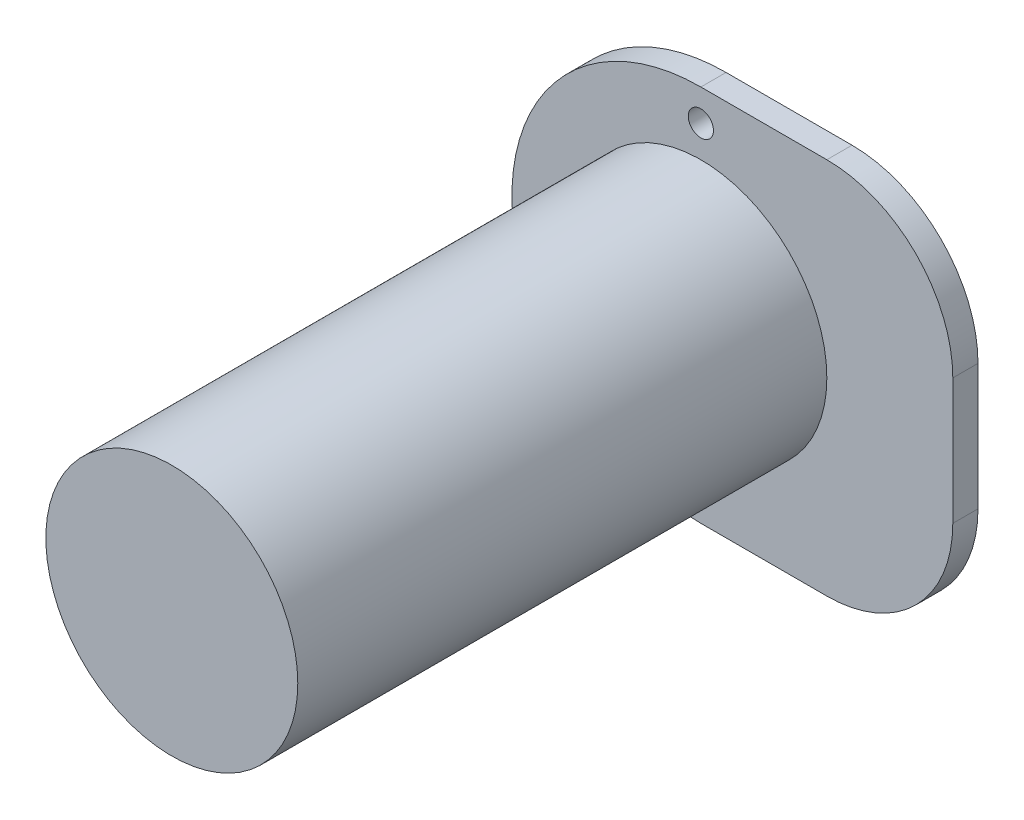
ISO-10303-21;
HEADER;
FILE_DESCRIPTION(('STEP AP214'),'2;1');
FILE_NAME('part.step','',(''),(''),'','','');
FILE_SCHEMA(('AUTOMOTIVE_DESIGN { 1 0 10303 214 1 1 1 1 }'));
ENDSEC;
DATA;
#1=APPLICATION_CONTEXT('core data for automotive mechanical design processes');
#2=APPLICATION_PROTOCOL_DEFINITION('international standard','automotive_design',2000,#1);
#3=PRODUCT_CONTEXT('',#1,'mechanical');
#4=PRODUCT('Part','Part','',(#3));
#5=PRODUCT_RELATED_PRODUCT_CATEGORY('part','',(#4));
#6=PRODUCT_DEFINITION_FORMATION('','',#4);
#7=PRODUCT_DEFINITION_CONTEXT('part definition',#1,'design');
#8=PRODUCT_DEFINITION('design','',#6,#7);
#9=PRODUCT_DEFINITION_SHAPE('','',#8);
#10=(LENGTH_UNIT() NAMED_UNIT(*) SI_UNIT(.MILLI.,.METRE.));
#11=(NAMED_UNIT(*) PLANE_ANGLE_UNIT() SI_UNIT($,.RADIAN.));
#12=(NAMED_UNIT(*) SI_UNIT($,.STERADIAN.) SOLID_ANGLE_UNIT());
#13=UNCERTAINTY_MEASURE_WITH_UNIT(LENGTH_MEASURE(1.E-05),#10,'distance_accuracy_value','');
#14=(GEOMETRIC_REPRESENTATION_CONTEXT(3) GLOBAL_UNCERTAINTY_ASSIGNED_CONTEXT((#13)) GLOBAL_UNIT_ASSIGNED_CONTEXT((#10,
#11,#12)) REPRESENTATION_CONTEXT('',''));
#15=CARTESIAN_POINT('',(0.,0.,0.));
#16=DIRECTION('',(0.,0.,1.));
#17=DIRECTION('',(1.,0.,0.));
#18=AXIS2_PLACEMENT_3D('',#15,#16,#17);
#19=CARTESIAN_POINT('',(0.,0.,105.));
#20=DIRECTION('',(0.,0.,-1.));
#21=DIRECTION('',(-1.,0.,0.));
#22=AXIS2_PLACEMENT_3D('',#19,#20,#21);
#23=CYLINDRICAL_SURFACE('',#22,50.);
#24=CARTESIAN_POINT('',(0.,0.,105.));
#25=DIRECTION('',(0.,0.,1.));
#26=DIRECTION('',(1.,0.,0.));
#27=AXIS2_PLACEMENT_3D('',#24,#25,#26);
#28=CIRCLE('',#27,50.);
#29=CARTESIAN_POINT('',(50.,0.,105.));
#30=VERTEX_POINT('',#29);
#31=EDGE_CURVE('E113',#30,#30,#28,.T.);
#32=ORIENTED_EDGE('',*,*,#31,.F.);
#33=EDGE_LOOP('',(#32));
#34=FACE_BOUND('',#33,.T.);
#35=CARTESIAN_POINT('',(0.,0.,-105.));
#36=DIRECTION('',(0.,0.,1.));
#37=DIRECTION('',(1.,0.,0.));
#38=AXIS2_PLACEMENT_3D('',#35,#36,#37);
#39=CIRCLE('',#38,50.);
#40=CARTESIAN_POINT('',(50.,0.,-105.));
#41=VERTEX_POINT('',#40);
#42=EDGE_CURVE('E109',#41,#41,#39,.T.);
#43=ORIENTED_EDGE('',*,*,#42,.T.);
#44=EDGE_LOOP('',(#43));
#45=FACE_BOUND('',#44,.T.);
#46=ADVANCED_FACE('F35',(#34,#45),#23,.T.);
#47=CARTESIAN_POINT('',(0.,0.,105.));
#48=DIRECTION('',(0.,0.,1.));
#49=DIRECTION('',(1.,0.,0.));
#50=AXIS2_PLACEMENT_3D('',#47,#48,#49);
#51=PLANE('',#50);
#52=ORIENTED_EDGE('',*,*,#31,.T.);
#53=EDGE_LOOP('',(#52));
#54=FACE_BOUND('',#53,.T.);
#55=ADVANCED_FACE('F160',(#54),#51,.T.);
#56=CARTESIAN_POINT('',(0.,0.,-115.));
#57=DIRECTION('',(0.,0.,1.));
#58=DIRECTION('',(1.,0.,0.));
#59=AXIS2_PLACEMENT_3D('',#56,#57,#58);
#60=CYLINDRICAL_SURFACE('',#59,75.);
#61=CARTESIAN_POINT('',(0.,0.,-105.));
#62=DIRECTION('',(0.,0.,-1.));
#63=DIRECTION('',(-1.,0.,0.));
#64=AXIS2_PLACEMENT_3D('',#61,#62,#63);
#65=CIRCLE('',#64,75.);
#66=CARTESIAN_POINT('',(0.,-75.,-105.));
#67=VERTEX_POINT('',#66);
#68=CARTESIAN_POINT('',(0.,75.,-105.));
#69=VERTEX_POINT('',#68);
#70=EDGE_CURVE('E108',#67,#69,#65,.T.);
#71=ORIENTED_EDGE('',*,*,#70,.T.);
#72=DIRECTION('',(0.,0.,1.));
#73=VECTOR('',#72,1.);
#74=CARTESIAN_POINT('',(0.,75.,-115.));
#75=LINE('',#74,#73);
#76=CARTESIAN_POINT('',(0.,75.,-115.));
#77=VERTEX_POINT('',#76);
#78=EDGE_CURVE('E92',#77,#69,#75,.T.);
#79=ORIENTED_EDGE('',*,*,#78,.F.);
#80=CARTESIAN_POINT('',(0.,0.,-115.));
#81=DIRECTION('',(0.,0.,-1.));
#82=DIRECTION('',(-1.,0.,0.));
#83=AXIS2_PLACEMENT_3D('',#80,#81,#82);
#84=CIRCLE('',#83,75.);
#85=CARTESIAN_POINT('',(0.,-75.,-115.));
#86=VERTEX_POINT('',#85);
#87=EDGE_CURVE('E96',#86,#77,#84,.T.);
#88=ORIENTED_EDGE('',*,*,#87,.F.);
#89=DIRECTION('',(0.,0.,1.));
#90=VECTOR('',#89,1.);
#91=CARTESIAN_POINT('',(0.,-75.,-115.));
#92=LINE('',#91,#90);
#93=EDGE_CURVE('E110',#86,#67,#92,.T.);
#94=ORIENTED_EDGE('',*,*,#93,.T.);
#95=EDGE_LOOP('',(#71,#79,#88,#94));
#96=FACE_BOUND('',#95,.T.);
#97=ADVANCED_FACE('F106',(#96),#60,.T.);
#98=CARTESIAN_POINT('',(0.,75.,-115.));
#99=DIRECTION('',(0.,-1.,0.));
#100=DIRECTION('',(1.,0.,0.));
#101=AXIS2_PLACEMENT_3D('',#98,#99,#100);
#102=PLANE('',#101);
#103=DIRECTION('',(1.,0.,0.));
#104=VECTOR('',#103,1.);
#105=CARTESIAN_POINT('',(0.,75.,-105.));
#106=LINE('',#105,#104);
#107=CARTESIAN_POINT('',(50.,75.,-105.));
#108=VERTEX_POINT('',#107);
#109=EDGE_CURVE('E142',#69,#108,#106,.T.);
#110=ORIENTED_EDGE('',*,*,#109,.T.);
#111=DIRECTION('',(0.,0.,1.));
#112=VECTOR('',#111,1.);
#113=CARTESIAN_POINT('',(50.,75.,-115.));
#114=LINE('',#113,#112);
#115=CARTESIAN_POINT('',(50.,75.,-115.));
#116=VERTEX_POINT('',#115);
#117=EDGE_CURVE('E58',#108,#116,#114,.F.);
#118=ORIENTED_EDGE('',*,*,#117,.T.);
#119=DIRECTION('',(1.,0.,0.));
#120=VECTOR('',#119,1.);
#121=CARTESIAN_POINT('',(0.,75.,-115.));
#122=LINE('',#121,#120);
#123=EDGE_CURVE('E88',#77,#116,#122,.T.);
#124=ORIENTED_EDGE('',*,*,#123,.F.);
#125=ORIENTED_EDGE('',*,*,#78,.T.);
#126=EDGE_LOOP('',(#110,#118,#124,#125));
#127=FACE_BOUND('',#126,.T.);
#128=ADVANCED_FACE('F90',(#127),#102,.F.);
#129=CARTESIAN_POINT('',(100.,-75.,-115.));
#130=DIRECTION('',(-1.,0.,0.));
#131=DIRECTION('',(0.,0.,1.));
#132=AXIS2_PLACEMENT_3D('',#129,#130,#131);
#133=PLANE('',#132);
#134=DIRECTION('',(0.,-1.,0.));
#135=VECTOR('',#134,1.);
#136=CARTESIAN_POINT('',(100.,-75.,-115.));
#137=LINE('',#136,#135);
#138=CARTESIAN_POINT('',(100.,25.,-115.));
#139=VERTEX_POINT('',#138);
#140=CARTESIAN_POINT('',(100.,-25.,-115.));
#141=VERTEX_POINT('',#140);
#142=EDGE_CURVE('E95',#139,#141,#137,.T.);
#143=ORIENTED_EDGE('',*,*,#142,.F.);
#144=DIRECTION('',(0.,0.,1.));
#145=VECTOR('',#144,1.);
#146=CARTESIAN_POINT('',(100.,25.,-115.));
#147=LINE('',#146,#145);
#148=CARTESIAN_POINT('',(100.,25.,-105.));
#149=VERTEX_POINT('',#148);
#150=EDGE_CURVE('E122',#139,#149,#147,.T.);
#151=ORIENTED_EDGE('',*,*,#150,.T.);
#152=DIRECTION('',(0.,-1.,0.));
#153=VECTOR('',#152,1.);
#154=CARTESIAN_POINT('',(100.,-75.,-105.));
#155=LINE('',#154,#153);
#156=CARTESIAN_POINT('',(100.,-25.,-105.));
#157=VERTEX_POINT('',#156);
#158=EDGE_CURVE('E143',#149,#157,#155,.T.);
#159=ORIENTED_EDGE('',*,*,#158,.T.);
#160=DIRECTION('',(0.,0.,1.));
#161=VECTOR('',#160,1.);
#162=CARTESIAN_POINT('',(100.,-25.,-115.));
#163=LINE('',#162,#161);
#164=EDGE_CURVE('E119',#157,#141,#163,.F.);
#165=ORIENTED_EDGE('',*,*,#164,.T.);
#166=EDGE_LOOP('',(#143,#151,#159,#165));
#167=FACE_BOUND('',#166,.T.);
#168=ADVANCED_FACE('F134',(#167),#133,.F.);
#169=CARTESIAN_POINT('',(0.,-75.,-115.));
#170=DIRECTION('',(0.,1.,0.));
#171=DIRECTION('',(-1.,0.,0.));
#172=AXIS2_PLACEMENT_3D('',#169,#170,#171);
#173=PLANE('',#172);
#174=DIRECTION('',(-1.,0.,0.));
#175=VECTOR('',#174,1.);
#176=CARTESIAN_POINT('',(0.,-75.,-115.));
#177=LINE('',#176,#175);
#178=CARTESIAN_POINT('',(50.,-75.,-115.));
#179=VERTEX_POINT('',#178);
#180=EDGE_CURVE('E100',#179,#86,#177,.T.);
#181=ORIENTED_EDGE('',*,*,#180,.F.);
#182=DIRECTION('',(0.,0.,1.));
#183=VECTOR('',#182,1.);
#184=CARTESIAN_POINT('',(50.,-75.,-115.));
#185=LINE('',#184,#183);
#186=CARTESIAN_POINT('',(50.,-75.,-105.));
#187=VERTEX_POINT('',#186);
#188=EDGE_CURVE('E11',#179,#187,#185,.T.);
#189=ORIENTED_EDGE('',*,*,#188,.T.);
#190=DIRECTION('',(-1.,0.,0.));
#191=VECTOR('',#190,1.);
#192=CARTESIAN_POINT('',(0.,-75.,-105.));
#193=LINE('',#192,#191);
#194=EDGE_CURVE('E104',#187,#67,#193,.T.);
#195=ORIENTED_EDGE('',*,*,#194,.T.);
#196=ORIENTED_EDGE('',*,*,#93,.F.);
#197=EDGE_LOOP('',(#181,#189,#195,#196));
#198=FACE_BOUND('',#197,.T.);
#199=ADVANCED_FACE('F151',(#198),#173,.F.);
#200=CARTESIAN_POINT('',(0.,0.,-115.));
#201=DIRECTION('',(0.,0.,-1.));
#202=DIRECTION('',(-1.,0.,0.));
#203=AXIS2_PLACEMENT_3D('',#200,#201,#202);
#204=PLANE('',#203);
#205=CARTESIAN_POINT('',(0.,62.5,-115.));
#206=DIRECTION('',(0.,0.,-1.));
#207=DIRECTION('',(-1.,0.,0.));
#208=AXIS2_PLACEMENT_3D('',#205,#206,#207);
#209=CIRCLE('',#208,5.);
#210=CARTESIAN_POINT('',(-5.,62.5,-115.));
#211=VERTEX_POINT('',#210);
#212=EDGE_CURVE('E202',#211,#211,#209,.T.);
#213=ORIENTED_EDGE('',*,*,#212,.F.);
#214=EDGE_LOOP('',(#213));
#215=FACE_BOUND('',#214,.T.);
#216=CARTESIAN_POINT('',(0.,-62.5,-115.));
#217=DIRECTION('',(0.,0.,-1.));
#218=DIRECTION('',(-1.,0.,0.));
#219=AXIS2_PLACEMENT_3D('',#216,#217,#218);
#220=CIRCLE('',#219,5.);
#221=CARTESIAN_POINT('',(-5.,-62.5,-115.));
#222=VERTEX_POINT('',#221);
#223=EDGE_CURVE('E207',#222,#222,#220,.T.);
#224=ORIENTED_EDGE('',*,*,#223,.F.);
#225=EDGE_LOOP('',(#224));
#226=FACE_BOUND('',#225,.T.);
#227=CARTESIAN_POINT('',(-62.5,0.,-115.));
#228=DIRECTION('',(0.,0.,-1.));
#229=DIRECTION('',(-1.,0.,0.));
#230=AXIS2_PLACEMENT_3D('',#227,#228,#229);
#231=CIRCLE('',#230,5.);
#232=CARTESIAN_POINT('',(-67.5,0.,-115.));
#233=VERTEX_POINT('',#232);
#234=EDGE_CURVE('E215',#233,#233,#231,.T.);
#235=ORIENTED_EDGE('',*,*,#234,.F.);
#236=EDGE_LOOP('',(#235));
#237=FACE_BOUND('',#236,.T.);
#238=ORIENTED_EDGE('',*,*,#123,.T.);
#239=CARTESIAN_POINT('',(50.,25.,-115.));
#240=DIRECTION('',(0.,0.,-1.));
#241=DIRECTION('',(-1.,0.,0.));
#242=AXIS2_PLACEMENT_3D('',#239,#240,#241);
#243=CIRCLE('',#242,50.);
#244=EDGE_CURVE('E43',#116,#139,#243,.T.);
#245=ORIENTED_EDGE('',*,*,#244,.T.);
#246=ORIENTED_EDGE('',*,*,#142,.T.);
#247=CARTESIAN_POINT('',(50.,-25.,-115.));
#248=DIRECTION('',(0.,0.,-1.));
#249=DIRECTION('',(-1.,0.,0.));
#250=AXIS2_PLACEMENT_3D('',#247,#248,#249);
#251=CIRCLE('',#250,50.);
#252=EDGE_CURVE('E50',#141,#179,#251,.T.);
#253=ORIENTED_EDGE('',*,*,#252,.T.);
#254=ORIENTED_EDGE('',*,*,#180,.T.);
#255=ORIENTED_EDGE('',*,*,#87,.T.);
#256=EDGE_LOOP('',(#238,#245,#246,#253,#254,#255));
#257=FACE_BOUND('',#256,.T.);
#258=ADVANCED_FACE('F99',(#215,#226,#237,#257),#204,.T.);
#259=CARTESIAN_POINT('',(0.,0.,-105.));
#260=DIRECTION('',(0.,0.,-1.));
#261=DIRECTION('',(-1.,0.,0.));
#262=AXIS2_PLACEMENT_3D('',#259,#260,#261);
#263=PLANE('',#262);
#264=CARTESIAN_POINT('',(0.,62.5,-105.));
#265=DIRECTION('',(0.,0.,-1.));
#266=DIRECTION('',(-1.,0.,0.));
#267=AXIS2_PLACEMENT_3D('',#264,#265,#266);
#268=CIRCLE('',#267,5.);
#269=CARTESIAN_POINT('',(-5.,62.5,-105.));
#270=VERTEX_POINT('',#269);
#271=EDGE_CURVE('E146',#270,#270,#268,.T.);
#272=ORIENTED_EDGE('',*,*,#271,.T.);
#273=EDGE_LOOP('',(#272));
#274=FACE_BOUND('',#273,.T.);
#275=CARTESIAN_POINT('',(0.,-62.5,-105.));
#276=DIRECTION('',(0.,0.,-1.));
#277=DIRECTION('',(-1.,0.,0.));
#278=AXIS2_PLACEMENT_3D('',#275,#276,#277);
#279=CIRCLE('',#278,5.);
#280=CARTESIAN_POINT('',(-5.,-62.5,-105.));
#281=VERTEX_POINT('',#280);
#282=EDGE_CURVE('E203',#281,#281,#279,.T.);
#283=ORIENTED_EDGE('',*,*,#282,.T.);
#284=EDGE_LOOP('',(#283));
#285=FACE_BOUND('',#284,.T.);
#286=CARTESIAN_POINT('',(-62.5,0.,-105.));
#287=DIRECTION('',(0.,0.,-1.));
#288=DIRECTION('',(-1.,0.,0.));
#289=AXIS2_PLACEMENT_3D('',#286,#287,#288);
#290=CIRCLE('',#289,5.);
#291=CARTESIAN_POINT('',(-67.5,0.,-105.));
#292=VERTEX_POINT('',#291);
#293=EDGE_CURVE('E212',#292,#292,#290,.T.);
#294=ORIENTED_EDGE('',*,*,#293,.T.);
#295=EDGE_LOOP('',(#294));
#296=FACE_BOUND('',#295,.T.);
#297=ORIENTED_EDGE('',*,*,#42,.F.);
#298=EDGE_LOOP('',(#297));
#299=FACE_BOUND('',#298,.T.);
#300=ORIENTED_EDGE('',*,*,#158,.F.);
#301=CARTESIAN_POINT('',(50.,25.,-105.));
#302=DIRECTION('',(0.,0.,-1.));
#303=DIRECTION('',(-1.,0.,0.));
#304=AXIS2_PLACEMENT_3D('',#301,#302,#303);
#305=CIRCLE('',#304,50.);
#306=EDGE_CURVE('E127',#149,#108,#305,.F.);
#307=ORIENTED_EDGE('',*,*,#306,.T.);
#308=ORIENTED_EDGE('',*,*,#109,.F.);
#309=ORIENTED_EDGE('',*,*,#70,.F.);
#310=ORIENTED_EDGE('',*,*,#194,.F.);
#311=CARTESIAN_POINT('',(50.,-25.,-105.));
#312=DIRECTION('',(0.,0.,-1.));
#313=DIRECTION('',(-1.,0.,0.));
#314=AXIS2_PLACEMENT_3D('',#311,#312,#313);
#315=CIRCLE('',#314,50.);
#316=EDGE_CURVE('E125',#187,#157,#315,.F.);
#317=ORIENTED_EDGE('',*,*,#316,.T.);
#318=EDGE_LOOP('',(#300,#307,#308,#309,#310,#317));
#319=FACE_BOUND('',#318,.T.);
#320=ADVANCED_FACE('F141',(#274,#285,#296,#299,#319),#263,.F.);
#321=CARTESIAN_POINT('',(-62.5,0.,-105.));
#322=DIRECTION('',(0.,0.,-1.));
#323=DIRECTION('',(-1.,0.,0.));
#324=AXIS2_PLACEMENT_3D('',#321,#322,#323);
#325=CYLINDRICAL_SURFACE('',#324,5.);
#326=ORIENTED_EDGE('',*,*,#293,.F.);
#327=EDGE_LOOP('',(#326));
#328=FACE_BOUND('',#327,.T.);
#329=ORIENTED_EDGE('',*,*,#234,.T.);
#330=EDGE_LOOP('',(#329));
#331=FACE_BOUND('',#330,.T.);
#332=ADVANCED_FACE('F181',(#328,#331),#325,.F.);
#333=CARTESIAN_POINT('',(0.,-62.5,-105.));
#334=DIRECTION('',(0.,0.,-1.));
#335=DIRECTION('',(-1.,0.,0.));
#336=AXIS2_PLACEMENT_3D('',#333,#334,#335);
#337=CYLINDRICAL_SURFACE('',#336,5.);
#338=ORIENTED_EDGE('',*,*,#282,.F.);
#339=EDGE_LOOP('',(#338));
#340=FACE_BOUND('',#339,.T.);
#341=ORIENTED_EDGE('',*,*,#223,.T.);
#342=EDGE_LOOP('',(#341));
#343=FACE_BOUND('',#342,.T.);
#344=ADVANCED_FACE('F188',(#340,#343),#337,.F.);
#345=CARTESIAN_POINT('',(0.,62.5,-105.));
#346=DIRECTION('',(0.,0.,-1.));
#347=DIRECTION('',(-1.,0.,0.));
#348=AXIS2_PLACEMENT_3D('',#345,#346,#347);
#349=CYLINDRICAL_SURFACE('',#348,5.);
#350=ORIENTED_EDGE('',*,*,#271,.F.);
#351=EDGE_LOOP('',(#350));
#352=FACE_BOUND('',#351,.T.);
#353=ORIENTED_EDGE('',*,*,#212,.T.);
#354=EDGE_LOOP('',(#353));
#355=FACE_BOUND('',#354,.T.);
#356=ADVANCED_FACE('F158',(#352,#355),#349,.F.);
#357=CARTESIAN_POINT('',(50.,25.,-115.));
#358=DIRECTION('',(0.,0.,1.));
#359=DIRECTION('',(1.,0.,0.));
#360=AXIS2_PLACEMENT_3D('',#357,#358,#359);
#361=CYLINDRICAL_SURFACE('',#360,50.);
#362=ORIENTED_EDGE('',*,*,#244,.F.);
#363=ORIENTED_EDGE('',*,*,#117,.F.);
#364=ORIENTED_EDGE('',*,*,#306,.F.);
#365=ORIENTED_EDGE('',*,*,#150,.F.);
#366=EDGE_LOOP('',(#362,#363,#364,#365));
#367=FACE_BOUND('',#366,.T.);
#368=ADVANCED_FACE('F139',(#367),#361,.T.);
#369=CARTESIAN_POINT('',(50.,-25.,-115.));
#370=DIRECTION('',(0.,0.,1.));
#371=DIRECTION('',(1.,0.,0.));
#372=AXIS2_PLACEMENT_3D('',#369,#370,#371);
#373=CYLINDRICAL_SURFACE('',#372,50.);
#374=ORIENTED_EDGE('',*,*,#252,.F.);
#375=ORIENTED_EDGE('',*,*,#164,.F.);
#376=ORIENTED_EDGE('',*,*,#316,.F.);
#377=ORIENTED_EDGE('',*,*,#188,.F.);
#378=EDGE_LOOP('',(#374,#375,#376,#377));
#379=FACE_BOUND('',#378,.T.);
#380=ADVANCED_FACE('F37',(#379),#373,.T.);
#381=CLOSED_SHELL('',(#46,#55,#97,#128,#168,#199,#258,#320,#332,#344,#356,#368,#380));
#382=MANIFOLD_SOLID_BREP('B2',#381);
#383=ADVANCED_BREP_SHAPE_REPRESENTATION('',(#18,#382),#14);
#384=SHAPE_DEFINITION_REPRESENTATION(#9,#383);
ENDSEC;
END-ISO-10303-21;
